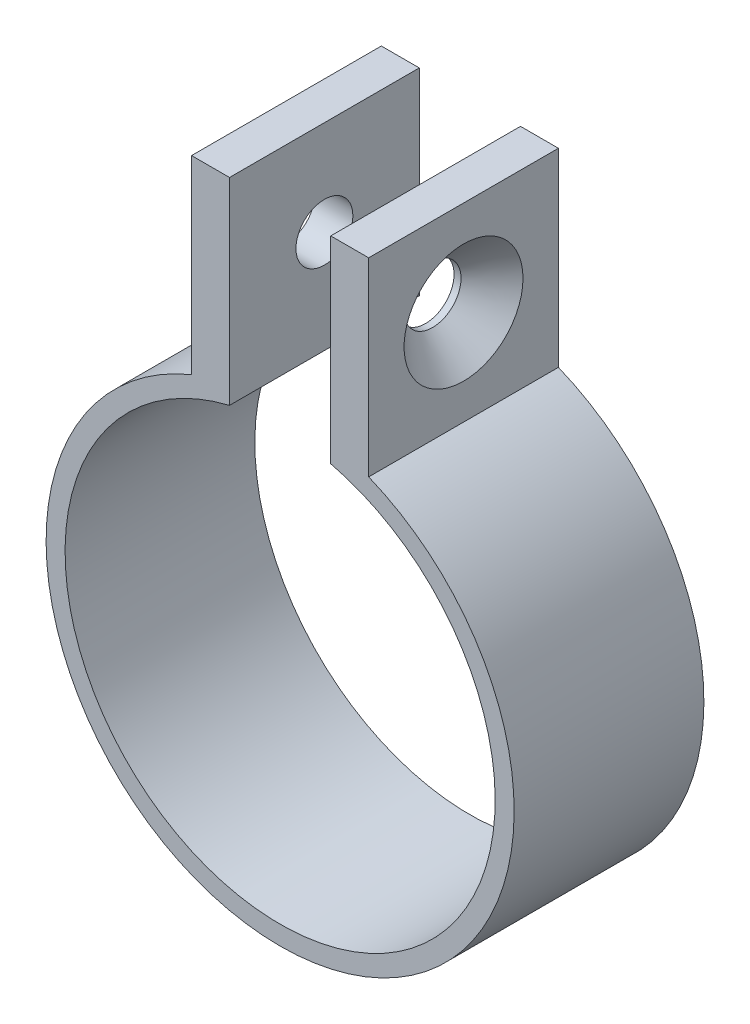
ISO-10303-21;
HEADER;
FILE_DESCRIPTION(('STEP AP214'),'2;1');
FILE_NAME('part.step','',(''),(''),'','','');
FILE_SCHEMA(('AUTOMOTIVE_DESIGN { 1 0 10303 214 1 1 1 1 }'));
ENDSEC;
DATA;
#1=APPLICATION_CONTEXT('core data for automotive mechanical design processes');
#2=APPLICATION_PROTOCOL_DEFINITION('international standard','automotive_design',2000,#1);
#3=PRODUCT_CONTEXT('',#1,'mechanical');
#4=PRODUCT('Part','Part','',(#3));
#5=PRODUCT_RELATED_PRODUCT_CATEGORY('part','',(#4));
#6=PRODUCT_DEFINITION_FORMATION('','',#4);
#7=PRODUCT_DEFINITION_CONTEXT('part definition',#1,'design');
#8=PRODUCT_DEFINITION('design','',#6,#7);
#9=PRODUCT_DEFINITION_SHAPE('','',#8);
#10=(LENGTH_UNIT() NAMED_UNIT(*) SI_UNIT(.MILLI.,.METRE.));
#11=(NAMED_UNIT(*) PLANE_ANGLE_UNIT() SI_UNIT($,.RADIAN.));
#12=(NAMED_UNIT(*) SI_UNIT($,.STERADIAN.) SOLID_ANGLE_UNIT());
#13=UNCERTAINTY_MEASURE_WITH_UNIT(LENGTH_MEASURE(1.E-05),#10,'distance_accuracy_value','');
#14=(GEOMETRIC_REPRESENTATION_CONTEXT(3) GLOBAL_UNCERTAINTY_ASSIGNED_CONTEXT((#13)) GLOBAL_UNIT_ASSIGNED_CONTEXT((#10,
#11,#12)) REPRESENTATION_CONTEXT('',''));
#15=CARTESIAN_POINT('',(0.,0.,0.));
#16=DIRECTION('',(0.,0.,1.));
#17=DIRECTION('',(1.,0.,0.));
#18=AXIS2_PLACEMENT_3D('',#15,#16,#17);
#19=CARTESIAN_POINT('',(6.99999999999999,26.2835276381734,-7.50000000003032));
#20=DIRECTION('',(1.,0.,0.));
#21=DIRECTION('',(0.,0.,-1.));
#22=AXIS2_PLACEMENT_3D('',#19,#20,#21);
#23=CYLINDRICAL_SURFACE('',#22,2.25);
#24=CARTESIAN_POINT('',(-7.,26.2835276381734,-7.50000000003032));
#25=DIRECTION('',(1.,0.,0.));
#26=DIRECTION('',(0.,0.,-1.));
#27=AXIS2_PLACEMENT_3D('',#24,#25,#26);
#28=CIRCLE('',#27,2.25);
#29=CARTESIAN_POINT('',(-7.,26.2835276381734,-9.75000000003032));
#30=VERTEX_POINT('',#29);
#31=EDGE_CURVE('E145',#30,#30,#28,.T.);
#32=ORIENTED_EDGE('',*,*,#31,.F.);
#33=EDGE_LOOP('',(#32));
#34=FACE_BOUND('',#33,.T.);
#35=CARTESIAN_POINT('',(-4.,26.2835276381734,-7.50000000003032));
#36=DIRECTION('',(1.,0.,0.));
#37=DIRECTION('',(0.,0.,-1.));
#38=AXIS2_PLACEMENT_3D('',#35,#36,#37);
#39=CIRCLE('',#38,2.25);
#40=CARTESIAN_POINT('',(-4.,26.2835276381734,-9.75000000003032));
#41=VERTEX_POINT('',#40);
#42=EDGE_CURVE('E20',#41,#41,#39,.F.);
#43=ORIENTED_EDGE('',*,*,#42,.F.);
#44=EDGE_LOOP('',(#43));
#45=FACE_BOUND('',#44,.T.);
#46=ADVANCED_FACE('F17',(#34,#45),#23,.F.);
#47=CARTESIAN_POINT('',(7.00000000006185,26.2835276381734,-7.50000000003032));
#48=DIRECTION('',(1.,0.,0.));
#49=DIRECTION('',(0.,0.,-1.));
#50=AXIS2_PLACEMENT_3D('',#47,#48,#49);
#51=CONICAL_SURFACE('',#50,4.69999999997677,0.785398163397448);
#52=CARTESIAN_POINT('',(7.00000000004215,26.2835276381734,-7.50000000003032));
#53=DIRECTION('',(1.,0.,0.));
#54=DIRECTION('',(0.,0.,-1.));
#55=AXIS2_PLACEMENT_3D('',#52,#53,#54);
#56=CIRCLE('',#55,4.69999999995707);
#57=CARTESIAN_POINT('',(7.00000000004215,26.2835276381734,-12.1999999999874));
#58=VERTEX_POINT('',#57);
#59=EDGE_CURVE('E134',#58,#58,#56,.F.);
#60=ORIENTED_EDGE('',*,*,#59,.F.);
#61=EDGE_LOOP('',(#60));
#62=FACE_BOUND('',#61,.T.);
#63=CARTESIAN_POINT('',(4.55,26.2835276381734,-7.50000000003032));
#64=DIRECTION('',(1.,0.,0.));
#65=DIRECTION('',(0.,0.,-1.));
#66=AXIS2_PLACEMENT_3D('',#63,#64,#65);
#67=CIRCLE('',#66,2.25);
#68=CARTESIAN_POINT('',(4.55,26.2835276381734,-9.75000000003032));
#69=VERTEX_POINT('',#68);
#70=EDGE_CURVE('E167',#69,#69,#67,.F.);
#71=ORIENTED_EDGE('',*,*,#70,.T.);
#72=EDGE_LOOP('',(#71));
#73=FACE_BOUND('',#72,.T.);
#74=ADVANCED_FACE('F183',(#62,#73),#51,.F.);
#75=CARTESIAN_POINT('',(6.99999999999999,26.2835276381734,-7.50000000003032));
#76=DIRECTION('',(1.,0.,0.));
#77=DIRECTION('',(0.,0.,-1.));
#78=AXIS2_PLACEMENT_3D('',#75,#76,#77);
#79=CYLINDRICAL_SURFACE('',#78,2.25);
#80=CARTESIAN_POINT('',(4.,26.2835276381734,-7.50000000003032));
#81=DIRECTION('',(1.,0.,0.));
#82=DIRECTION('',(0.,0.,-1.));
#83=AXIS2_PLACEMENT_3D('',#80,#81,#82);
#84=CIRCLE('',#83,2.25);
#85=CARTESIAN_POINT('',(4.,26.2835276381734,-9.75000000003032));
#86=VERTEX_POINT('',#85);
#87=EDGE_CURVE('E124',#86,#86,#84,.T.);
#88=ORIENTED_EDGE('',*,*,#87,.F.);
#89=EDGE_LOOP('',(#88));
#90=FACE_BOUND('',#89,.T.);
#91=ORIENTED_EDGE('',*,*,#70,.F.);
#92=EDGE_LOOP('',(#91));
#93=FACE_BOUND('',#92,.T.);
#94=ADVANCED_FACE('F200',(#90,#93),#79,.F.);
#95=CARTESIAN_POINT('',(0.,1.65898384862962,-77.7044211671477));
#96=DIRECTION('',(0.,0.,1.));
#97=DIRECTION('',(1.,0.,0.));
#98=AXIS2_PLACEMENT_3D('',#95,#96,#97);
#99=CYLINDRICAL_SURFACE('',#98,17.);
#100=CARTESIAN_POINT('',(0.,1.65898384862962,-15.0000000000606));
#101=DIRECTION('',(0.,0.,1.));
#102=DIRECTION('',(1.,0.,0.));
#103=AXIS2_PLACEMENT_3D('',#100,#101,#102);
#104=CIRCLE('',#103,17.);
#105=CARTESIAN_POINT('',(4.,18.1816954904879,-15.0000000000606));
#106=VERTEX_POINT('',#105);
#107=CARTESIAN_POINT('',(-4.,18.1816954904879,-15.0000000000606));
#108=VERTEX_POINT('',#107);
#109=EDGE_CURVE('E79',#106,#108,#104,.F.);
#110=ORIENTED_EDGE('',*,*,#109,.T.);
#111=DIRECTION('',(0.,0.,-1.));
#112=VECTOR('',#111,1.);
#113=CARTESIAN_POINT('',(-4.,18.1816954904879,-77.7044211671477));
#114=LINE('',#113,#112);
#115=CARTESIAN_POINT('',(-4.,18.1816954904879,0.));
#116=VERTEX_POINT('',#115);
#117=EDGE_CURVE('E158',#116,#108,#114,.T.);
#118=ORIENTED_EDGE('',*,*,#117,.F.);
#119=CARTESIAN_POINT('',(0.,1.65898384862962,0.));
#120=DIRECTION('',(0.,0.,1.));
#121=DIRECTION('',(1.,0.,0.));
#122=AXIS2_PLACEMENT_3D('',#119,#120,#121);
#123=CIRCLE('',#122,17.);
#124=CARTESIAN_POINT('',(4.,18.1816954904879,0.));
#125=VERTEX_POINT('',#124);
#126=EDGE_CURVE('E139',#125,#116,#123,.F.);
#127=ORIENTED_EDGE('',*,*,#126,.F.);
#128=DIRECTION('',(0.,0.,1.));
#129=VECTOR('',#128,1.);
#130=CARTESIAN_POINT('',(4.,18.1816954904879,-77.7044211671477));
#131=LINE('',#130,#129);
#132=EDGE_CURVE('E99',#106,#125,#131,.T.);
#133=ORIENTED_EDGE('',*,*,#132,.F.);
#134=EDGE_LOOP('',(#110,#118,#127,#133));
#135=FACE_BOUND('',#134,.T.);
#136=ADVANCED_FACE('F190',(#135),#99,.F.);
#137=CARTESIAN_POINT('',(-4.,18.1816954904879,-77.7044211671477));
#138=DIRECTION('',(1.,0.,0.));
#139=DIRECTION('',(0.,0.,-1.));
#140=AXIS2_PLACEMENT_3D('',#137,#138,#139);
#141=PLANE('',#140);
#142=DIRECTION('',(0.,1.,0.));
#143=VECTOR('',#142,1.);
#144=CARTESIAN_POINT('',(-4.,1.65898384862962,0.));
#145=LINE('',#144,#143);
#146=CARTESIAN_POINT('',(-4.,33.7835276381734,0.));
#147=VERTEX_POINT('',#146);
#148=EDGE_CURVE('E152',#116,#147,#145,.T.);
#149=ORIENTED_EDGE('',*,*,#148,.F.);
#150=ORIENTED_EDGE('',*,*,#117,.T.);
#151=DIRECTION('',(0.,-1.,0.));
#152=VECTOR('',#151,1.);
#153=CARTESIAN_POINT('',(-4.,1.65898384858448,-15.0000000000606));
#154=LINE('',#153,#152);
#155=CARTESIAN_POINT('',(-4.,33.7835276381733,-15.0000000000607));
#156=VERTEX_POINT('',#155);
#157=EDGE_CURVE('E120',#108,#156,#154,.F.);
#158=ORIENTED_EDGE('',*,*,#157,.T.);
#159=DIRECTION('',(0.,0.,1.));
#160=VECTOR('',#159,1.);
#161=CARTESIAN_POINT('',(-4.,33.7835276381733,-77.7044211671477));
#162=LINE('',#161,#160);
#163=EDGE_CURVE('E155',#147,#156,#162,.F.);
#164=ORIENTED_EDGE('',*,*,#163,.F.);
#165=EDGE_LOOP('',(#149,#150,#158,#164));
#166=FACE_BOUND('',#165,.T.);
#167=ORIENTED_EDGE('',*,*,#42,.T.);
#168=EDGE_LOOP('',(#167));
#169=FACE_BOUND('',#168,.T.);
#170=ADVANCED_FACE('F187',(#166,#169),#141,.T.);
#171=CARTESIAN_POINT('',(-4.,33.7835276381733,-77.7044211671477));
#172=DIRECTION('',(0.,1.,0.));
#173=DIRECTION('',(0.,0.,1.));
#174=AXIS2_PLACEMENT_3D('',#171,#172,#173);
#175=PLANE('',#174);
#176=DIRECTION('',(1.,0.,0.));
#177=VECTOR('',#176,1.);
#178=CARTESIAN_POINT('',(0.,33.7835276381734,0.));
#179=LINE('',#178,#177);
#180=CARTESIAN_POINT('',(-7.,33.7835276381734,0.));
#181=VERTEX_POINT('',#180);
#182=EDGE_CURVE('E148',#147,#181,#179,.F.);
#183=ORIENTED_EDGE('',*,*,#182,.F.);
#184=ORIENTED_EDGE('',*,*,#163,.T.);
#185=DIRECTION('',(1.,0.,0.));
#186=VECTOR('',#185,1.);
#187=CARTESIAN_POINT('',(0.,33.7835276381733,-15.0000000000607));
#188=LINE('',#187,#186);
#189=CARTESIAN_POINT('',(-7.,33.7835276381733,-15.0000000000607));
#190=VERTEX_POINT('',#189);
#191=EDGE_CURVE('E117',#156,#190,#188,.F.);
#192=ORIENTED_EDGE('',*,*,#191,.T.);
#193=DIRECTION('',(0.,0.,1.));
#194=VECTOR('',#193,1.);
#195=CARTESIAN_POINT('',(-7.,33.7835276381733,-77.7044211671477));
#196=LINE('',#195,#194);
#197=EDGE_CURVE('E142',#181,#190,#196,.F.);
#198=ORIENTED_EDGE('',*,*,#197,.F.);
#199=EDGE_LOOP('',(#183,#184,#192,#198));
#200=FACE_BOUND('',#199,.T.);
#201=ADVANCED_FACE('F189',(#200),#175,.T.);
#202=CARTESIAN_POINT('',(-7.,33.7835276381733,-77.7044211671477));
#203=DIRECTION('',(-1.,0.,0.));
#204=DIRECTION('',(0.,-1.,0.));
#205=AXIS2_PLACEMENT_3D('',#202,#203,#204);
#206=PLANE('',#205);
#207=DIRECTION('',(0.,1.,0.));
#208=VECTOR('',#207,1.);
#209=CARTESIAN_POINT('',(-7.,1.65898384862962,0.));
#210=LINE('',#209,#208);
#211=CARTESIAN_POINT('',(-7.,18.7835276381734,0.));
#212=VERTEX_POINT('',#211);
#213=EDGE_CURVE('E151',#181,#212,#210,.F.);
#214=ORIENTED_EDGE('',*,*,#213,.F.);
#215=ORIENTED_EDGE('',*,*,#197,.T.);
#216=DIRECTION('',(0.,-1.,0.));
#217=VECTOR('',#216,1.);
#218=CARTESIAN_POINT('',(-7.,1.65898384858448,-15.0000000000606));
#219=LINE('',#218,#217);
#220=CARTESIAN_POINT('',(-7.,18.7835276381734,-15.0000000000606));
#221=VERTEX_POINT('',#220);
#222=EDGE_CURVE('E112',#190,#221,#219,.T.);
#223=ORIENTED_EDGE('',*,*,#222,.T.);
#224=DIRECTION('',(0.,0.,1.));
#225=VECTOR('',#224,1.);
#226=CARTESIAN_POINT('',(-7.,18.7835276381734,-77.7044211671477));
#227=LINE('',#226,#225);
#228=EDGE_CURVE('E98',#212,#221,#227,.F.);
#229=ORIENTED_EDGE('',*,*,#228,.F.);
#230=EDGE_LOOP('',(#214,#215,#223,#229));
#231=FACE_BOUND('',#230,.T.);
#232=ORIENTED_EDGE('',*,*,#31,.T.);
#233=EDGE_LOOP('',(#232));
#234=FACE_BOUND('',#233,.T.);
#235=ADVANCED_FACE('F179',(#231,#234),#206,.T.);
#236=CARTESIAN_POINT('',(7.,33.7835276381733,-77.7044211671477));
#237=DIRECTION('',(1.,0.,0.));
#238=DIRECTION('',(0.,1.,0.));
#239=AXIS2_PLACEMENT_3D('',#236,#237,#238);
#240=PLANE('',#239);
#241=DIRECTION('',(0.,1.,0.));
#242=VECTOR('',#241,1.);
#243=CARTESIAN_POINT('',(7.,1.65898384862962,0.));
#244=LINE('',#243,#242);
#245=CARTESIAN_POINT('',(7.,18.7835276381734,0.));
#246=VERTEX_POINT('',#245);
#247=CARTESIAN_POINT('',(7.,33.7835276381734,0.));
#248=VERTEX_POINT('',#247);
#249=EDGE_CURVE('E130',#246,#248,#244,.T.);
#250=ORIENTED_EDGE('',*,*,#249,.F.);
#251=DIRECTION('',(0.,0.,1.));
#252=VECTOR('',#251,1.);
#253=CARTESIAN_POINT('',(7.,18.7835276381734,-77.7044211671477));
#254=LINE('',#253,#252);
#255=CARTESIAN_POINT('',(7.,18.7835276381734,-15.0000000000606));
#256=VERTEX_POINT('',#255);
#257=EDGE_CURVE('E103',#256,#246,#254,.T.);
#258=ORIENTED_EDGE('',*,*,#257,.F.);
#259=DIRECTION('',(0.,-1.,0.));
#260=VECTOR('',#259,1.);
#261=CARTESIAN_POINT('',(7.,1.65898384858448,-15.0000000000606));
#262=LINE('',#261,#260);
#263=CARTESIAN_POINT('',(7.,33.7835276381733,-15.0000000000607));
#264=VERTEX_POINT('',#263);
#265=EDGE_CURVE('E88',#256,#264,#262,.F.);
#266=ORIENTED_EDGE('',*,*,#265,.T.);
#267=DIRECTION('',(0.,0.,1.));
#268=VECTOR('',#267,1.);
#269=CARTESIAN_POINT('',(7.,33.7835276381733,-77.7044211671477));
#270=LINE('',#269,#268);
#271=EDGE_CURVE('E85',#248,#264,#270,.F.);
#272=ORIENTED_EDGE('',*,*,#271,.F.);
#273=EDGE_LOOP('',(#250,#258,#266,#272));
#274=FACE_BOUND('',#273,.T.);
#275=ORIENTED_EDGE('',*,*,#59,.T.);
#276=EDGE_LOOP('',(#275));
#277=FACE_BOUND('',#276,.T.);
#278=ADVANCED_FACE('F221',(#274,#277),#240,.T.);
#279=CARTESIAN_POINT('',(4.,33.7835276381733,-77.7044211671477));
#280=DIRECTION('',(0.,1.,0.));
#281=DIRECTION('',(0.,0.,1.));
#282=AXIS2_PLACEMENT_3D('',#279,#280,#281);
#283=PLANE('',#282);
#284=DIRECTION('',(1.,0.,0.));
#285=VECTOR('',#284,1.);
#286=CARTESIAN_POINT('',(0.,33.7835276381734,0.));
#287=LINE('',#286,#285);
#288=CARTESIAN_POINT('',(4.,33.7835276381734,0.));
#289=VERTEX_POINT('',#288);
#290=EDGE_CURVE('E128',#248,#289,#287,.F.);
#291=ORIENTED_EDGE('',*,*,#290,.F.);
#292=ORIENTED_EDGE('',*,*,#271,.T.);
#293=DIRECTION('',(1.,0.,0.));
#294=VECTOR('',#293,1.);
#295=CARTESIAN_POINT('',(0.,33.7835276381733,-15.0000000000607));
#296=LINE('',#295,#294);
#297=CARTESIAN_POINT('',(4.,33.7835276381733,-15.0000000000607));
#298=VERTEX_POINT('',#297);
#299=EDGE_CURVE('E83',#264,#298,#296,.F.);
#300=ORIENTED_EDGE('',*,*,#299,.T.);
#301=DIRECTION('',(0.,0.,1.));
#302=VECTOR('',#301,1.);
#303=CARTESIAN_POINT('',(4.,33.7835276381733,-77.7044211671477));
#304=LINE('',#303,#302);
#305=EDGE_CURVE('E35',#289,#298,#304,.F.);
#306=ORIENTED_EDGE('',*,*,#305,.F.);
#307=EDGE_LOOP('',(#291,#292,#300,#306));
#308=FACE_BOUND('',#307,.T.);
#309=ADVANCED_FACE('F84',(#308),#283,.T.);
#310=CARTESIAN_POINT('',(4.,18.1816954904879,-77.7044211671477));
#311=DIRECTION('',(-1.,0.,0.));
#312=DIRECTION('',(0.,0.,1.));
#313=AXIS2_PLACEMENT_3D('',#310,#311,#312);
#314=PLANE('',#313);
#315=DIRECTION('',(0.,1.,0.));
#316=VECTOR('',#315,1.);
#317=CARTESIAN_POINT('',(4.,1.65898384862962,0.));
#318=LINE('',#317,#316);
#319=EDGE_CURVE('E96',#289,#125,#318,.F.);
#320=ORIENTED_EDGE('',*,*,#319,.F.);
#321=ORIENTED_EDGE('',*,*,#305,.T.);
#322=DIRECTION('',(0.,-1.,0.));
#323=VECTOR('',#322,1.);
#324=CARTESIAN_POINT('',(4.,1.65898384858448,-15.0000000000606));
#325=LINE('',#324,#323);
#326=EDGE_CURVE('E87',#298,#106,#325,.T.);
#327=ORIENTED_EDGE('',*,*,#326,.T.);
#328=ORIENTED_EDGE('',*,*,#132,.T.);
#329=EDGE_LOOP('',(#320,#321,#327,#328));
#330=FACE_BOUND('',#329,.T.);
#331=ORIENTED_EDGE('',*,*,#87,.T.);
#332=EDGE_LOOP('',(#331));
#333=FACE_BOUND('',#332,.T.);
#334=ADVANCED_FACE('F92',(#330,#333),#314,.T.);
#335=CARTESIAN_POINT('',(0.,1.65898384858448,-15.0000000000606));
#336=DIRECTION('',(0.,0.,1.));
#337=DIRECTION('',(0.,-1.,0.));
#338=AXIS2_PLACEMENT_3D('',#335,#336,#337);
#339=PLANE('',#338);
#340=ORIENTED_EDGE('',*,*,#109,.F.);
#341=ORIENTED_EDGE('',*,*,#326,.F.);
#342=ORIENTED_EDGE('',*,*,#299,.F.);
#343=ORIENTED_EDGE('',*,*,#265,.F.);
#344=CARTESIAN_POINT('',(0.,1.65898384862962,-15.0000000000606));
#345=DIRECTION('',(0.,0.,1.));
#346=DIRECTION('',(1.,0.,0.));
#347=AXIS2_PLACEMENT_3D('',#344,#345,#346);
#348=CIRCLE('',#347,18.5);
#349=EDGE_CURVE('E26',#221,#256,#348,.T.);
#350=ORIENTED_EDGE('',*,*,#349,.F.);
#351=ORIENTED_EDGE('',*,*,#222,.F.);
#352=ORIENTED_EDGE('',*,*,#191,.F.);
#353=ORIENTED_EDGE('',*,*,#157,.F.);
#354=EDGE_LOOP('',(#340,#341,#342,#343,#350,#351,#352,#353));
#355=FACE_BOUND('',#354,.T.);
#356=ADVANCED_FACE('F101',(#355),#339,.F.);
#357=CARTESIAN_POINT('',(0.,1.65898384862962,0.));
#358=DIRECTION('',(0.,0.,1.));
#359=DIRECTION('',(1.,0.,0.));
#360=AXIS2_PLACEMENT_3D('',#357,#358,#359);
#361=PLANE('',#360);
#362=ORIENTED_EDGE('',*,*,#290,.T.);
#363=ORIENTED_EDGE('',*,*,#319,.T.);
#364=ORIENTED_EDGE('',*,*,#126,.T.);
#365=ORIENTED_EDGE('',*,*,#148,.T.);
#366=ORIENTED_EDGE('',*,*,#182,.T.);
#367=ORIENTED_EDGE('',*,*,#213,.T.);
#368=CARTESIAN_POINT('',(0.,1.65898384862962,0.));
#369=DIRECTION('',(0.,0.,1.));
#370=DIRECTION('',(1.,0.,0.));
#371=AXIS2_PLACEMENT_3D('',#368,#369,#370);
#372=CIRCLE('',#371,18.5);
#373=EDGE_CURVE('E11',#246,#212,#372,.F.);
#374=ORIENTED_EDGE('',*,*,#373,.F.);
#375=ORIENTED_EDGE('',*,*,#249,.T.);
#376=EDGE_LOOP('',(#362,#363,#364,#365,#366,#367,#374,#375));
#377=FACE_BOUND('',#376,.T.);
#378=ADVANCED_FACE('F206',(#377),#361,.T.);
#379=CARTESIAN_POINT('',(0.,1.65898384862962,-77.7044211671477));
#380=DIRECTION('',(0.,0.,1.));
#381=DIRECTION('',(1.,0.,0.));
#382=AXIS2_PLACEMENT_3D('',#379,#380,#381);
#383=CYLINDRICAL_SURFACE('',#382,18.5);
#384=ORIENTED_EDGE('',*,*,#349,.T.);
#385=ORIENTED_EDGE('',*,*,#257,.T.);
#386=ORIENTED_EDGE('',*,*,#373,.T.);
#387=ORIENTED_EDGE('',*,*,#228,.T.);
#388=EDGE_LOOP('',(#384,#385,#386,#387));
#389=FACE_BOUND('',#388,.T.);
#390=ADVANCED_FACE('F204',(#389),#383,.T.);
#391=CLOSED_SHELL('',(#46,#74,#94,#136,#170,#201,#235,#278,#309,#334,#356,#378,#390));
#392=MANIFOLD_SOLID_BREP('B1',#391);
#393=ADVANCED_BREP_SHAPE_REPRESENTATION('',(#18,#392),#14);
#394=SHAPE_DEFINITION_REPRESENTATION(#9,#393);
ENDSEC;
END-ISO-10303-21;
